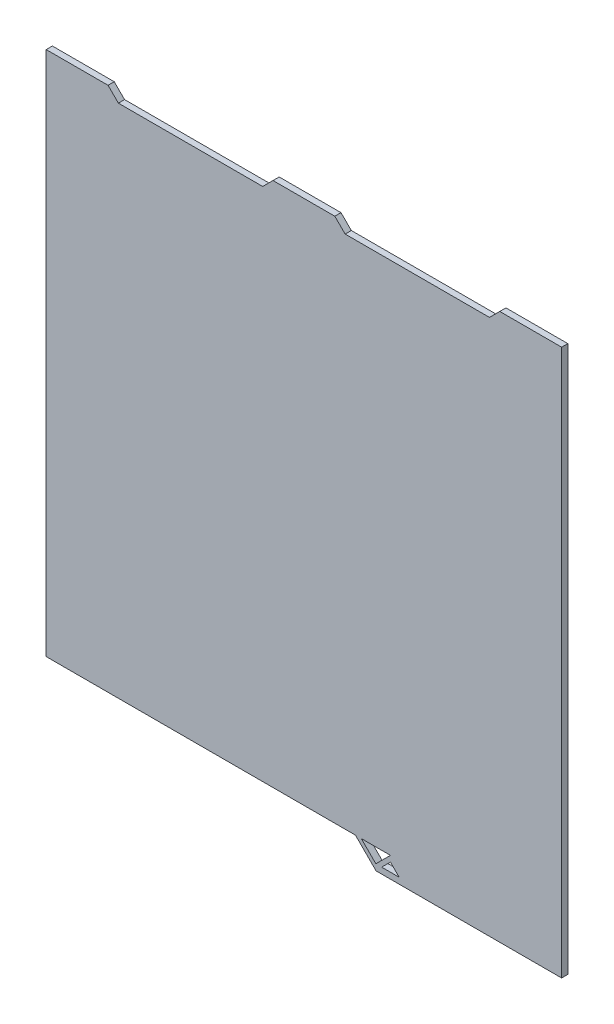
ISO-10303-21;
HEADER;
FILE_DESCRIPTION(('STEP AP214'),'2;1');
FILE_NAME('part.step','',(''),(''),'','','');
FILE_SCHEMA(('AUTOMOTIVE_DESIGN { 1 0 10303 214 1 1 1 1 }'));
ENDSEC;
DATA;
#1=APPLICATION_CONTEXT('core data for automotive mechanical design processes');
#2=APPLICATION_PROTOCOL_DEFINITION('international standard','automotive_design',2000,#1);
#3=PRODUCT_CONTEXT('',#1,'mechanical');
#4=PRODUCT('Part','Part','',(#3));
#5=PRODUCT_RELATED_PRODUCT_CATEGORY('part','',(#4));
#6=PRODUCT_DEFINITION_FORMATION('','',#4);
#7=PRODUCT_DEFINITION_CONTEXT('part definition',#1,'design');
#8=PRODUCT_DEFINITION('design','',#6,#7);
#9=PRODUCT_DEFINITION_SHAPE('','',#8);
#10=(LENGTH_UNIT() NAMED_UNIT(*) SI_UNIT(.MILLI.,.METRE.));
#11=(NAMED_UNIT(*) PLANE_ANGLE_UNIT() SI_UNIT($,.RADIAN.));
#12=(NAMED_UNIT(*) SI_UNIT($,.STERADIAN.) SOLID_ANGLE_UNIT());
#13=UNCERTAINTY_MEASURE_WITH_UNIT(LENGTH_MEASURE(1.E-05),#10,'distance_accuracy_value','');
#14=(GEOMETRIC_REPRESENTATION_CONTEXT(3) GLOBAL_UNCERTAINTY_ASSIGNED_CONTEXT((#13)) GLOBAL_UNIT_ASSIGNED_CONTEXT((#10,
#11,#12)) REPRESENTATION_CONTEXT('',''));
#15=CARTESIAN_POINT('',(0.,0.,0.));
#16=DIRECTION('',(0.,0.,1.));
#17=DIRECTION('',(1.,0.,0.));
#18=AXIS2_PLACEMENT_3D('',#15,#16,#17);
#19=CARTESIAN_POINT('',(-125.,130.,-3.));
#20=DIRECTION('',(0.,1.,0.));
#21=DIRECTION('',(0.,0.,1.));
#22=AXIS2_PLACEMENT_3D('',#19,#20,#21);
#23=PLANE('',#22);
#24=DIRECTION('',(-1.,0.,0.));
#25=VECTOR('',#24,1.);
#26=CARTESIAN_POINT('',(-125.,130.,0.));
#27=LINE('',#26,#25);
#28=CARTESIAN_POINT('',(-95.,130.,0.));
#29=VERTEX_POINT('',#28);
#30=CARTESIAN_POINT('',(-125.,130.,0.));
#31=VERTEX_POINT('',#30);
#32=EDGE_CURVE('E250',#29,#31,#27,.T.);
#33=ORIENTED_EDGE('',*,*,#32,.F.);
#34=DIRECTION('',(0.,0.,1.));
#35=VECTOR('',#34,1.);
#36=CARTESIAN_POINT('',(-95.,130.,-3.));
#37=LINE('',#36,#35);
#38=CARTESIAN_POINT('',(-95.,130.,-3.));
#39=VERTEX_POINT('',#38);
#40=EDGE_CURVE('E49',#39,#29,#37,.T.);
#41=ORIENTED_EDGE('',*,*,#40,.F.);
#42=DIRECTION('',(-1.,0.,0.));
#43=VECTOR('',#42,1.);
#44=CARTESIAN_POINT('',(-125.,130.,-3.));
#45=LINE('',#44,#43);
#46=CARTESIAN_POINT('',(-125.,130.,-3.));
#47=VERTEX_POINT('',#46);
#48=EDGE_CURVE('E297',#39,#47,#45,.T.);
#49=ORIENTED_EDGE('',*,*,#48,.T.);
#50=DIRECTION('',(0.,0.,1.));
#51=VECTOR('',#50,1.);
#52=CARTESIAN_POINT('',(-125.,130.,-3.));
#53=LINE('',#52,#51);
#54=EDGE_CURVE('E11',#47,#31,#53,.T.);
#55=ORIENTED_EDGE('',*,*,#54,.T.);
#56=EDGE_LOOP('',(#33,#41,#49,#55));
#57=FACE_BOUND('',#56,.T.);
#58=ADVANCED_FACE('F39',(#57),#23,.T.);
#59=CARTESIAN_POINT('',(-95.,130.,-3.));
#60=DIRECTION('',(0.707106781186539,0.707106781186556,0.));
#61=DIRECTION('',(-0.707106781186556,0.707106781186539,0.));
#62=AXIS2_PLACEMENT_3D('',#59,#60,#61);
#63=PLANE('',#62);
#64=DIRECTION('',(-0.707106781186556,0.707106781186539,0.));
#65=VECTOR('',#64,1.);
#66=CARTESIAN_POINT('',(-95.,130.,0.));
#67=LINE('',#66,#65);
#68=CARTESIAN_POINT('',(-89.9999999999999,125.,0.));
#69=VERTEX_POINT('',#68);
#70=EDGE_CURVE('E348',#69,#29,#67,.T.);
#71=ORIENTED_EDGE('',*,*,#70,.F.);
#72=DIRECTION('',(0.,0.,1.));
#73=VECTOR('',#72,1.);
#74=CARTESIAN_POINT('',(-89.9999999999999,125.,-3.));
#75=LINE('',#74,#73);
#76=CARTESIAN_POINT('',(-89.9999999999999,125.,-3.));
#77=VERTEX_POINT('',#76);
#78=EDGE_CURVE('E357',#77,#69,#75,.T.);
#79=ORIENTED_EDGE('',*,*,#78,.F.);
#80=DIRECTION('',(-0.707106781186556,0.707106781186539,0.));
#81=VECTOR('',#80,1.);
#82=CARTESIAN_POINT('',(-95.,130.,-3.));
#83=LINE('',#82,#81);
#84=EDGE_CURVE('E293',#77,#39,#83,.T.);
#85=ORIENTED_EDGE('',*,*,#84,.T.);
#86=ORIENTED_EDGE('',*,*,#40,.T.);
#87=EDGE_LOOP('',(#71,#79,#85,#86));
#88=FACE_BOUND('',#87,.T.);
#89=ADVANCED_FACE('F446',(#88),#63,.T.);
#90=CARTESIAN_POINT('',(-19.9999999999999,125.,-3.));
#91=DIRECTION('',(0.,1.,0.));
#92=DIRECTION('',(0.,0.,1.));
#93=AXIS2_PLACEMENT_3D('',#90,#91,#92);
#94=PLANE('',#93);
#95=DIRECTION('',(-1.,0.,0.));
#96=VECTOR('',#95,1.);
#97=CARTESIAN_POINT('',(-19.9999999999999,125.,0.));
#98=LINE('',#97,#96);
#99=CARTESIAN_POINT('',(-19.9999999999999,125.,0.));
#100=VERTEX_POINT('',#99);
#101=EDGE_CURVE('E344',#100,#69,#98,.T.);
#102=ORIENTED_EDGE('',*,*,#101,.F.);
#103=DIRECTION('',(0.,0.,1.));
#104=VECTOR('',#103,1.);
#105=CARTESIAN_POINT('',(-19.9999999999999,125.,-3.));
#106=LINE('',#105,#104);
#107=CARTESIAN_POINT('',(-19.9999999999999,125.,-3.));
#108=VERTEX_POINT('',#107);
#109=EDGE_CURVE('E360',#108,#100,#106,.T.);
#110=ORIENTED_EDGE('',*,*,#109,.F.);
#111=DIRECTION('',(-1.,0.,0.));
#112=VECTOR('',#111,1.);
#113=CARTESIAN_POINT('',(-19.9999999999999,125.,-3.));
#114=LINE('',#113,#112);
#115=EDGE_CURVE('E289',#108,#77,#114,.T.);
#116=ORIENTED_EDGE('',*,*,#115,.T.);
#117=ORIENTED_EDGE('',*,*,#78,.T.);
#118=EDGE_LOOP('',(#102,#110,#116,#117));
#119=FACE_BOUND('',#118,.T.);
#120=ADVANCED_FACE('F444',(#119),#94,.T.);
#121=CARTESIAN_POINT('',(-15.,130.,-3.));
#122=DIRECTION('',(-0.707106781186557,0.707106781186538,0.));
#123=DIRECTION('',(-0.707106781186538,-0.707106781186557,0.));
#124=AXIS2_PLACEMENT_3D('',#121,#122,#123);
#125=PLANE('',#124);
#126=DIRECTION('',(-0.707106781186538,-0.707106781186557,0.));
#127=VECTOR('',#126,1.);
#128=CARTESIAN_POINT('',(-15.,130.,0.));
#129=LINE('',#128,#127);
#130=CARTESIAN_POINT('',(-15.,130.,0.));
#131=VERTEX_POINT('',#130);
#132=EDGE_CURVE('E340',#131,#100,#129,.T.);
#133=ORIENTED_EDGE('',*,*,#132,.F.);
#134=DIRECTION('',(0.,0.,1.));
#135=VECTOR('',#134,1.);
#136=CARTESIAN_POINT('',(-15.,130.,-3.));
#137=LINE('',#136,#135);
#138=CARTESIAN_POINT('',(-15.,130.,-3.));
#139=VERTEX_POINT('',#138);
#140=EDGE_CURVE('E363',#139,#131,#137,.T.);
#141=ORIENTED_EDGE('',*,*,#140,.F.);
#142=DIRECTION('',(-0.707106781186538,-0.707106781186557,0.));
#143=VECTOR('',#142,1.);
#144=CARTESIAN_POINT('',(-15.,130.,-3.));
#145=LINE('',#144,#143);
#146=EDGE_CURVE('E285',#139,#108,#145,.T.);
#147=ORIENTED_EDGE('',*,*,#146,.T.);
#148=ORIENTED_EDGE('',*,*,#109,.T.);
#149=EDGE_LOOP('',(#133,#141,#147,#148));
#150=FACE_BOUND('',#149,.T.);
#151=ADVANCED_FACE('F440',(#150),#125,.T.);
#152=CARTESIAN_POINT('',(-15.,130.,-3.));
#153=DIRECTION('',(0.,1.,0.));
#154=DIRECTION('',(0.,0.,1.));
#155=AXIS2_PLACEMENT_3D('',#152,#153,#154);
#156=PLANE('',#155);
#157=DIRECTION('',(-1.,0.,0.));
#158=VECTOR('',#157,1.);
#159=CARTESIAN_POINT('',(-15.,130.,0.));
#160=LINE('',#159,#158);
#161=CARTESIAN_POINT('',(15.,130.,0.));
#162=VERTEX_POINT('',#161);
#163=EDGE_CURVE('E336',#162,#131,#160,.T.);
#164=ORIENTED_EDGE('',*,*,#163,.F.);
#165=DIRECTION('',(0.,0.,1.));
#166=VECTOR('',#165,1.);
#167=CARTESIAN_POINT('',(15.,130.,-3.));
#168=LINE('',#167,#166);
#169=CARTESIAN_POINT('',(15.,130.,-3.));
#170=VERTEX_POINT('',#169);
#171=EDGE_CURVE('E366',#170,#162,#168,.T.);
#172=ORIENTED_EDGE('',*,*,#171,.F.);
#173=DIRECTION('',(-1.,0.,0.));
#174=VECTOR('',#173,1.);
#175=CARTESIAN_POINT('',(-15.,130.,-3.));
#176=LINE('',#175,#174);
#177=EDGE_CURVE('E281',#170,#139,#176,.T.);
#178=ORIENTED_EDGE('',*,*,#177,.T.);
#179=ORIENTED_EDGE('',*,*,#140,.T.);
#180=EDGE_LOOP('',(#164,#172,#178,#179));
#181=FACE_BOUND('',#180,.T.);
#182=ADVANCED_FACE('F436',(#181),#156,.T.);
#183=CARTESIAN_POINT('',(15.,130.,-3.));
#184=DIRECTION('',(0.707106781186533,0.707106781186562,0.));
#185=DIRECTION('',(-0.707106781186562,0.707106781186533,0.));
#186=AXIS2_PLACEMENT_3D('',#183,#184,#185);
#187=PLANE('',#186);
#188=DIRECTION('',(-0.707106781186562,0.707106781186533,0.));
#189=VECTOR('',#188,1.);
#190=CARTESIAN_POINT('',(15.,130.,0.));
#191=LINE('',#190,#189);
#192=CARTESIAN_POINT('',(20.0000000000001,125.,0.));
#193=VERTEX_POINT('',#192);
#194=EDGE_CURVE('E332',#193,#162,#191,.T.);
#195=ORIENTED_EDGE('',*,*,#194,.F.);
#196=DIRECTION('',(0.,0.,1.));
#197=VECTOR('',#196,1.);
#198=CARTESIAN_POINT('',(20.0000000000001,125.,-3.));
#199=LINE('',#198,#197);
#200=CARTESIAN_POINT('',(20.0000000000001,125.,-3.));
#201=VERTEX_POINT('',#200);
#202=EDGE_CURVE('E369',#201,#193,#199,.T.);
#203=ORIENTED_EDGE('',*,*,#202,.F.);
#204=DIRECTION('',(-0.707106781186562,0.707106781186533,0.));
#205=VECTOR('',#204,1.);
#206=CARTESIAN_POINT('',(15.,130.,-3.));
#207=LINE('',#206,#205);
#208=EDGE_CURVE('E277',#201,#170,#207,.T.);
#209=ORIENTED_EDGE('',*,*,#208,.T.);
#210=ORIENTED_EDGE('',*,*,#171,.T.);
#211=EDGE_LOOP('',(#195,#203,#209,#210));
#212=FACE_BOUND('',#211,.T.);
#213=ADVANCED_FACE('F432',(#212),#187,.T.);
#214=CARTESIAN_POINT('',(89.9999999999999,125.,-3.));
#215=DIRECTION('',(0.,1.,0.));
#216=DIRECTION('',(0.,0.,1.));
#217=AXIS2_PLACEMENT_3D('',#214,#215,#216);
#218=PLANE('',#217);
#219=DIRECTION('',(-1.,0.,0.));
#220=VECTOR('',#219,1.);
#221=CARTESIAN_POINT('',(89.9999999999999,125.,0.));
#222=LINE('',#221,#220);
#223=CARTESIAN_POINT('',(89.9999999999999,125.,0.));
#224=VERTEX_POINT('',#223);
#225=EDGE_CURVE('E328',#224,#193,#222,.T.);
#226=ORIENTED_EDGE('',*,*,#225,.F.);
#227=DIRECTION('',(0.,0.,1.));
#228=VECTOR('',#227,1.);
#229=CARTESIAN_POINT('',(89.9999999999999,125.,-3.));
#230=LINE('',#229,#228);
#231=CARTESIAN_POINT('',(89.9999999999999,125.,-3.));
#232=VERTEX_POINT('',#231);
#233=EDGE_CURVE('E372',#232,#224,#230,.T.);
#234=ORIENTED_EDGE('',*,*,#233,.F.);
#235=DIRECTION('',(-1.,0.,0.));
#236=VECTOR('',#235,1.);
#237=CARTESIAN_POINT('',(89.9999999999999,125.,-3.));
#238=LINE('',#237,#236);
#239=EDGE_CURVE('E273',#232,#201,#238,.T.);
#240=ORIENTED_EDGE('',*,*,#239,.T.);
#241=ORIENTED_EDGE('',*,*,#202,.T.);
#242=EDGE_LOOP('',(#226,#234,#240,#241));
#243=FACE_BOUND('',#242,.T.);
#244=ADVANCED_FACE('F428',(#243),#218,.T.);
#245=CARTESIAN_POINT('',(95.,130.,-3.));
#246=DIRECTION('',(-0.707106781186546,0.707106781186548,0.));
#247=DIRECTION('',(-0.707106781186549,-0.707106781186547,0.));
#248=AXIS2_PLACEMENT_3D('',#245,#246,#247);
#249=PLANE('',#248);
#250=DIRECTION('',(-0.707106781186549,-0.707106781186547,0.));
#251=VECTOR('',#250,1.);
#252=CARTESIAN_POINT('',(95.,130.,0.));
#253=LINE('',#252,#251);
#254=CARTESIAN_POINT('',(95.,130.,0.));
#255=VERTEX_POINT('',#254);
#256=EDGE_CURVE('E324',#255,#224,#253,.T.);
#257=ORIENTED_EDGE('',*,*,#256,.F.);
#258=DIRECTION('',(0.,0.,1.));
#259=VECTOR('',#258,1.);
#260=CARTESIAN_POINT('',(95.,130.,-3.));
#261=LINE('',#260,#259);
#262=CARTESIAN_POINT('',(95.,130.,-3.));
#263=VERTEX_POINT('',#262);
#264=EDGE_CURVE('E375',#263,#255,#261,.T.);
#265=ORIENTED_EDGE('',*,*,#264,.F.);
#266=DIRECTION('',(-0.707106781186549,-0.707106781186547,0.));
#267=VECTOR('',#266,1.);
#268=CARTESIAN_POINT('',(95.,130.,-3.));
#269=LINE('',#268,#267);
#270=EDGE_CURVE('E269',#263,#232,#269,.T.);
#271=ORIENTED_EDGE('',*,*,#270,.T.);
#272=ORIENTED_EDGE('',*,*,#233,.T.);
#273=EDGE_LOOP('',(#257,#265,#271,#272));
#274=FACE_BOUND('',#273,.T.);
#275=ADVANCED_FACE('F426',(#274),#249,.T.);
#276=CARTESIAN_POINT('',(125.,130.,-3.));
#277=DIRECTION('',(0.,1.,0.));
#278=DIRECTION('',(0.,0.,1.));
#279=AXIS2_PLACEMENT_3D('',#276,#277,#278);
#280=PLANE('',#279);
#281=DIRECTION('',(-1.,0.,0.));
#282=VECTOR('',#281,1.);
#283=CARTESIAN_POINT('',(125.,130.,0.));
#284=LINE('',#283,#282);
#285=CARTESIAN_POINT('',(125.,130.,0.));
#286=VERTEX_POINT('',#285);
#287=EDGE_CURVE('E320',#286,#255,#284,.T.);
#288=ORIENTED_EDGE('',*,*,#287,.F.);
#289=DIRECTION('',(0.,0.,1.));
#290=VECTOR('',#289,1.);
#291=CARTESIAN_POINT('',(125.,130.,-3.));
#292=LINE('',#291,#290);
#293=CARTESIAN_POINT('',(125.,130.,-3.));
#294=VERTEX_POINT('',#293);
#295=EDGE_CURVE('E378',#294,#286,#292,.T.);
#296=ORIENTED_EDGE('',*,*,#295,.F.);
#297=DIRECTION('',(-1.,0.,0.));
#298=VECTOR('',#297,1.);
#299=CARTESIAN_POINT('',(125.,130.,-3.));
#300=LINE('',#299,#298);
#301=EDGE_CURVE('E265',#294,#263,#300,.T.);
#302=ORIENTED_EDGE('',*,*,#301,.T.);
#303=ORIENTED_EDGE('',*,*,#264,.T.);
#304=EDGE_LOOP('',(#288,#296,#302,#303));
#305=FACE_BOUND('',#304,.T.);
#306=ADVANCED_FACE('F422',(#305),#280,.T.);
#307=CARTESIAN_POINT('',(125.,125.,-3.));
#308=DIRECTION('',(1.,0.,0.));
#309=DIRECTION('',(0.,1.,0.));
#310=AXIS2_PLACEMENT_3D('',#307,#308,#309);
#311=PLANE('',#310);
#312=DIRECTION('',(0.,1.,0.));
#313=VECTOR('',#312,1.);
#314=CARTESIAN_POINT('',(125.,125.,0.));
#315=LINE('',#314,#313);
#316=CARTESIAN_POINT('',(125.,-135.,0.));
#317=VERTEX_POINT('',#316);
#318=EDGE_CURVE('E316',#317,#286,#315,.T.);
#319=ORIENTED_EDGE('',*,*,#318,.F.);
#320=DIRECTION('',(0.,0.,1.));
#321=VECTOR('',#320,1.);
#322=CARTESIAN_POINT('',(125.,-135.,-3.));
#323=LINE('',#322,#321);
#324=CARTESIAN_POINT('',(125.,-135.,-3.));
#325=VERTEX_POINT('',#324);
#326=EDGE_CURVE('E381',#325,#317,#323,.T.);
#327=ORIENTED_EDGE('',*,*,#326,.F.);
#328=DIRECTION('',(0.,1.,0.));
#329=VECTOR('',#328,1.);
#330=CARTESIAN_POINT('',(125.,-125.,-3.));
#331=LINE('',#330,#329);
#332=EDGE_CURVE('E262',#325,#294,#331,.T.);
#333=ORIENTED_EDGE('',*,*,#332,.T.);
#334=ORIENTED_EDGE('',*,*,#295,.T.);
#335=EDGE_LOOP('',(#319,#327,#333,#334));
#336=FACE_BOUND('',#335,.T.);
#337=ADVANCED_FACE('F415',(#336),#311,.T.);
#338=CARTESIAN_POINT('',(125.,-135.,-3.));
#339=DIRECTION('',(0.,-1.,0.));
#340=DIRECTION('',(0.,0.,-1.));
#341=AXIS2_PLACEMENT_3D('',#338,#339,#340);
#342=PLANE('',#341);
#343=DIRECTION('',(1.,0.,0.));
#344=VECTOR('',#343,1.);
#345=CARTESIAN_POINT('',(125.,-135.,0.));
#346=LINE('',#345,#344);
#347=CARTESIAN_POINT('',(35.,-135.,0.));
#348=VERTEX_POINT('',#347);
#349=EDGE_CURVE('E312',#348,#317,#346,.T.);
#350=ORIENTED_EDGE('',*,*,#349,.F.);
#351=DIRECTION('',(0.,0.,1.));
#352=VECTOR('',#351,1.);
#353=CARTESIAN_POINT('',(35.,-135.,-3.));
#354=LINE('',#353,#352);
#355=CARTESIAN_POINT('',(35.,-135.,-3.));
#356=VERTEX_POINT('',#355);
#357=EDGE_CURVE('E385',#356,#348,#354,.T.);
#358=ORIENTED_EDGE('',*,*,#357,.F.);
#359=DIRECTION('',(1.,0.,0.));
#360=VECTOR('',#359,1.);
#361=CARTESIAN_POINT('',(125.,-135.,-3.));
#362=LINE('',#361,#360);
#363=EDGE_CURVE('E258',#356,#325,#362,.T.);
#364=ORIENTED_EDGE('',*,*,#363,.T.);
#365=ORIENTED_EDGE('',*,*,#326,.T.);
#366=EDGE_LOOP('',(#350,#358,#364,#365));
#367=FACE_BOUND('',#366,.T.);
#368=ADVANCED_FACE('F413',(#367),#342,.T.);
#369=CARTESIAN_POINT('',(35.,-135.,-3.));
#370=DIRECTION('',(-0.707106781186544,-0.707106781186551,0.));
#371=DIRECTION('',(0.707106781186551,-0.707106781186544,0.));
#372=AXIS2_PLACEMENT_3D('',#369,#370,#371);
#373=PLANE('',#372);
#374=DIRECTION('',(0.707106781186551,-0.707106781186544,0.));
#375=VECTOR('',#374,1.);
#376=CARTESIAN_POINT('',(35.,-135.,0.));
#377=LINE('',#376,#375);
#378=CARTESIAN_POINT('',(24.9999999999999,-125.,0.));
#379=VERTEX_POINT('',#378);
#380=EDGE_CURVE('E308',#379,#348,#377,.T.);
#381=ORIENTED_EDGE('',*,*,#380,.F.);
#382=DIRECTION('',(0.,0.,1.));
#383=VECTOR('',#382,1.);
#384=CARTESIAN_POINT('',(24.9999999999999,-125.,-3.));
#385=LINE('',#384,#383);
#386=CARTESIAN_POINT('',(24.9999999999999,-125.,-3.));
#387=VERTEX_POINT('',#386);
#388=EDGE_CURVE('E387',#387,#379,#385,.T.);
#389=ORIENTED_EDGE('',*,*,#388,.F.);
#390=DIRECTION('',(0.707106781186551,-0.707106781186544,0.));
#391=VECTOR('',#390,1.);
#392=CARTESIAN_POINT('',(35.,-135.,-3.));
#393=LINE('',#392,#391);
#394=EDGE_CURVE('E254',#387,#356,#393,.T.);
#395=ORIENTED_EDGE('',*,*,#394,.T.);
#396=ORIENTED_EDGE('',*,*,#357,.T.);
#397=EDGE_LOOP('',(#381,#389,#395,#396));
#398=FACE_BOUND('',#397,.T.);
#399=ADVANCED_FACE('F410',(#398),#373,.T.);
#400=CARTESIAN_POINT('',(-125.,-125.,-3.));
#401=DIRECTION('',(0.,-1.,0.));
#402=DIRECTION('',(1.,0.,0.));
#403=AXIS2_PLACEMENT_3D('',#400,#401,#402);
#404=PLANE('',#403);
#405=DIRECTION('',(1.,0.,0.));
#406=VECTOR('',#405,1.);
#407=CARTESIAN_POINT('',(-125.,-125.,0.));
#408=LINE('',#407,#406);
#409=CARTESIAN_POINT('',(-125.,-125.,0.));
#410=VERTEX_POINT('',#409);
#411=EDGE_CURVE('E304',#410,#379,#408,.T.);
#412=ORIENTED_EDGE('',*,*,#411,.F.);
#413=DIRECTION('',(0.,0.,1.));
#414=VECTOR('',#413,1.);
#415=CARTESIAN_POINT('',(-125.,-125.,-3.));
#416=LINE('',#415,#414);
#417=CARTESIAN_POINT('',(-125.,-125.,-3.));
#418=VERTEX_POINT('',#417);
#419=EDGE_CURVE('E43',#418,#410,#416,.T.);
#420=ORIENTED_EDGE('',*,*,#419,.F.);
#421=DIRECTION('',(1.,0.,0.));
#422=VECTOR('',#421,1.);
#423=CARTESIAN_POINT('',(-125.,-125.,-3.));
#424=LINE('',#423,#422);
#425=EDGE_CURVE('E249',#418,#387,#424,.T.);
#426=ORIENTED_EDGE('',*,*,#425,.T.);
#427=ORIENTED_EDGE('',*,*,#388,.T.);
#428=EDGE_LOOP('',(#412,#420,#426,#427));
#429=FACE_BOUND('',#428,.T.);
#430=ADVANCED_FACE('F397',(#429),#404,.T.);
#431=CARTESIAN_POINT('',(-125.,125.,-3.));
#432=DIRECTION('',(-1.,0.,0.));
#433=DIRECTION('',(0.,-1.,0.));
#434=AXIS2_PLACEMENT_3D('',#431,#432,#433);
#435=PLANE('',#434);
#436=DIRECTION('',(0.,-1.,0.));
#437=VECTOR('',#436,1.);
#438=CARTESIAN_POINT('',(-125.,125.,0.));
#439=LINE('',#438,#437);
#440=EDGE_CURVE('E245',#31,#410,#439,.T.);
#441=ORIENTED_EDGE('',*,*,#440,.F.);
#442=ORIENTED_EDGE('',*,*,#54,.F.);
#443=DIRECTION('',(0.,-1.,0.));
#444=VECTOR('',#443,1.);
#445=CARTESIAN_POINT('',(-125.,125.,-3.));
#446=LINE('',#445,#444);
#447=EDGE_CURVE('E246',#47,#418,#446,.T.);
#448=ORIENTED_EDGE('',*,*,#447,.T.);
#449=ORIENTED_EDGE('',*,*,#419,.T.);
#450=EDGE_LOOP('',(#441,#442,#448,#449));
#451=FACE_BOUND('',#450,.T.);
#452=ADVANCED_FACE('F41',(#451),#435,.T.);
#453=CARTESIAN_POINT('',(0.,0.,-3.));
#454=DIRECTION('',(0.,0.,-1.));
#455=DIRECTION('',(-1.,0.,0.));
#456=AXIS2_PLACEMENT_3D('',#453,#454,#455);
#457=PLANE('',#456);
#458=DIRECTION('',(0.70710678118655,0.707106781186545,0.));
#459=VECTOR('',#458,1.);
#460=CARTESIAN_POINT('',(84.8994949366115,-84.8994949366122,-3.));
#461=LINE('',#460,#459);
#462=CARTESIAN_POINT('',(37.7279220613578,-132.071067811865,-3.));
#463=VERTEX_POINT('',#462);
#464=CARTESIAN_POINT('',(41.9705627484771,-127.828427124746,-3.));
#465=VERTEX_POINT('',#464);
#466=EDGE_CURVE('E242',#463,#465,#461,.T.);
#467=ORIENTED_EDGE('',*,*,#466,.F.);
#468=DIRECTION('',(-1.,0.,0.));
#469=VECTOR('',#468,1.);
#470=CARTESIAN_POINT('',(-4.32007890795257E-13,-132.071067811865,-3.));
#471=LINE('',#470,#469);
#472=CARTESIAN_POINT('',(46.2132034355964,-132.071067811866,-3.));
#473=VERTEX_POINT('',#472);
#474=EDGE_CURVE('E237',#473,#463,#471,.T.);
#475=ORIENTED_EDGE('',*,*,#474,.F.);
#476=DIRECTION('',(0.707106781186541,-0.707106781186554,0.));
#477=VECTOR('',#476,1.);
#478=CARTESIAN_POINT('',(-42.9289321881341,-42.9289321881333,-3.));
#479=LINE('',#478,#477);
#480=EDGE_CURVE('E184',#465,#473,#479,.T.);
#481=ORIENTED_EDGE('',*,*,#480,.F.);
#482=EDGE_LOOP('',(#467,#475,#481));
#483=FACE_BOUND('',#482,.T.);
#484=DIRECTION('',(-0.707106781186549,0.707106781186546,0.));
#485=VECTOR('',#484,1.);
#486=CARTESIAN_POINT('',(-48.585786437627,-48.5857864376273,-3.));
#487=LINE('',#486,#485);
#488=CARTESIAN_POINT('',(34.8994949366116,-132.071067811865,-3.));
#489=VERTEX_POINT('',#488);
#490=CARTESIAN_POINT('',(27.8284271247461,-125.,-3.));
#491=VERTEX_POINT('',#490);
#492=EDGE_CURVE('E234',#489,#491,#487,.T.);
#493=ORIENTED_EDGE('',*,*,#492,.F.);
#494=DIRECTION('',(-0.707106781186546,-0.707106781186549,0.));
#495=VECTOR('',#494,1.);
#496=CARTESIAN_POINT('',(83.4852813742386,-83.4852813742382,-3.));
#497=LINE('',#496,#495);
#498=CARTESIAN_POINT('',(41.9705627484771,-125.,-3.));
#499=VERTEX_POINT('',#498);
#500=EDGE_CURVE('E223',#499,#489,#497,.T.);
#501=ORIENTED_EDGE('',*,*,#500,.F.);
#502=DIRECTION('',(1.,0.,0.));
#503=VECTOR('',#502,1.);
#504=CARTESIAN_POINT('',(3.6799042000401E-13,-125.,-3.));
#505=LINE('',#504,#503);
#506=EDGE_CURVE('E231',#491,#499,#505,.T.);
#507=ORIENTED_EDGE('',*,*,#506,.F.);
#508=EDGE_LOOP('',(#493,#501,#507));
#509=FACE_BOUND('',#508,.T.);
#510=ORIENTED_EDGE('',*,*,#447,.F.);
#511=ORIENTED_EDGE('',*,*,#48,.F.);
#512=ORIENTED_EDGE('',*,*,#84,.F.);
#513=ORIENTED_EDGE('',*,*,#115,.F.);
#514=ORIENTED_EDGE('',*,*,#146,.F.);
#515=ORIENTED_EDGE('',*,*,#177,.F.);
#516=ORIENTED_EDGE('',*,*,#208,.F.);
#517=ORIENTED_EDGE('',*,*,#239,.F.);
#518=ORIENTED_EDGE('',*,*,#270,.F.);
#519=ORIENTED_EDGE('',*,*,#301,.F.);
#520=ORIENTED_EDGE('',*,*,#332,.F.);
#521=ORIENTED_EDGE('',*,*,#363,.F.);
#522=ORIENTED_EDGE('',*,*,#394,.F.);
#523=ORIENTED_EDGE('',*,*,#425,.F.);
#524=EDGE_LOOP('',(#510,#511,#512,#513,#514,#515,#516,#517,#518,#519,#520,#521,#522,#523));
#525=FACE_BOUND('',#524,.T.);
#526=ADVANCED_FACE('F404',(#483,#509,#525),#457,.T.);
#527=CARTESIAN_POINT('',(0.,0.,0.));
#528=DIRECTION('',(0.,0.,-1.));
#529=DIRECTION('',(-1.,0.,0.));
#530=AXIS2_PLACEMENT_3D('',#527,#528,#529);
#531=PLANE('',#530);
#532=DIRECTION('',(1.,0.,0.));
#533=VECTOR('',#532,1.);
#534=CARTESIAN_POINT('',(37.7279220613578,-132.071067811865,0.));
#535=LINE('',#534,#533);
#536=CARTESIAN_POINT('',(37.7279220613578,-132.071067811865,0.));
#537=VERTEX_POINT('',#536);
#538=CARTESIAN_POINT('',(46.2132034355964,-132.071067811866,0.));
#539=VERTEX_POINT('',#538);
#540=EDGE_CURVE('E192',#537,#539,#535,.T.);
#541=ORIENTED_EDGE('',*,*,#540,.F.);
#542=DIRECTION('',(-0.70710678118655,-0.707106781186545,0.));
#543=VECTOR('',#542,1.);
#544=CARTESIAN_POINT('',(37.7279220613578,-132.071067811865,0.));
#545=LINE('',#544,#543);
#546=CARTESIAN_POINT('',(41.9705627484771,-127.828427124746,0.));
#547=VERTEX_POINT('',#546);
#548=EDGE_CURVE('E197',#547,#537,#545,.T.);
#549=ORIENTED_EDGE('',*,*,#548,.F.);
#550=DIRECTION('',(-0.707106781186541,0.707106781186554,0.));
#551=VECTOR('',#550,1.);
#552=CARTESIAN_POINT('',(46.2132034355964,-132.071067811866,0.));
#553=LINE('',#552,#551);
#554=EDGE_CURVE('E181',#539,#547,#553,.T.);
#555=ORIENTED_EDGE('',*,*,#554,.F.);
#556=EDGE_LOOP('',(#541,#549,#555));
#557=FACE_BOUND('',#556,.T.);
#558=DIRECTION('',(0.707106781186546,0.707106781186549,0.));
#559=VECTOR('',#558,1.);
#560=CARTESIAN_POINT('',(34.8994949366116,-132.071067811865,0.));
#561=LINE('',#560,#559);
#562=CARTESIAN_POINT('',(34.8994949366116,-132.071067811865,0.));
#563=VERTEX_POINT('',#562);
#564=CARTESIAN_POINT('',(41.9705627484771,-125.,0.));
#565=VERTEX_POINT('',#564);
#566=EDGE_CURVE('E212',#563,#565,#561,.T.);
#567=ORIENTED_EDGE('',*,*,#566,.F.);
#568=DIRECTION('',(0.707106781186549,-0.707106781186546,0.));
#569=VECTOR('',#568,1.);
#570=CARTESIAN_POINT('',(27.8284271247461,-125.,0.));
#571=LINE('',#570,#569);
#572=CARTESIAN_POINT('',(27.8284271247461,-125.,0.));
#573=VERTEX_POINT('',#572);
#574=EDGE_CURVE('E208',#573,#563,#571,.T.);
#575=ORIENTED_EDGE('',*,*,#574,.F.);
#576=DIRECTION('',(-1.,0.,0.));
#577=VECTOR('',#576,1.);
#578=CARTESIAN_POINT('',(27.8284271247461,-125.,0.));
#579=LINE('',#578,#577);
#580=EDGE_CURVE('E215',#565,#573,#579,.T.);
#581=ORIENTED_EDGE('',*,*,#580,.F.);
#582=EDGE_LOOP('',(#567,#575,#581));
#583=FACE_BOUND('',#582,.T.);
#584=ORIENTED_EDGE('',*,*,#32,.T.);
#585=ORIENTED_EDGE('',*,*,#440,.T.);
#586=ORIENTED_EDGE('',*,*,#411,.T.);
#587=ORIENTED_EDGE('',*,*,#380,.T.);
#588=ORIENTED_EDGE('',*,*,#349,.T.);
#589=ORIENTED_EDGE('',*,*,#318,.T.);
#590=ORIENTED_EDGE('',*,*,#287,.T.);
#591=ORIENTED_EDGE('',*,*,#256,.T.);
#592=ORIENTED_EDGE('',*,*,#225,.T.);
#593=ORIENTED_EDGE('',*,*,#194,.T.);
#594=ORIENTED_EDGE('',*,*,#163,.T.);
#595=ORIENTED_EDGE('',*,*,#132,.T.);
#596=ORIENTED_EDGE('',*,*,#101,.T.);
#597=ORIENTED_EDGE('',*,*,#70,.T.);
#598=EDGE_LOOP('',(#584,#585,#586,#587,#588,#589,#590,#591,#592,#593,#594,#595,#596,#597));
#599=FACE_BOUND('',#598,.T.);
#600=ADVANCED_FACE('F199',(#557,#583,#599),#531,.F.);
#601=CARTESIAN_POINT('',(27.8284271247461,-125.,-9.));
#602=DIRECTION('',(-0.707106781186546,-0.707106781186549,0.));
#603=DIRECTION('',(0.707106781186549,-0.707106781186546,0.));
#604=AXIS2_PLACEMENT_3D('',#601,#602,#603);
#605=PLANE('',#604);
#606=ORIENTED_EDGE('',*,*,#492,.T.);
#607=DIRECTION('',(0.,0.,1.));
#608=VECTOR('',#607,1.);
#609=CARTESIAN_POINT('',(27.8284271247461,-125.,-9.));
#610=LINE('',#609,#608);
#611=EDGE_CURVE('E220',#491,#573,#610,.T.);
#612=ORIENTED_EDGE('',*,*,#611,.T.);
#613=ORIENTED_EDGE('',*,*,#574,.T.);
#614=DIRECTION('',(0.,0.,1.));
#615=VECTOR('',#614,1.);
#616=CARTESIAN_POINT('',(34.8994949366116,-132.071067811865,-9.));
#617=LINE('',#616,#615);
#618=EDGE_CURVE('E219',#489,#563,#617,.T.);
#619=ORIENTED_EDGE('',*,*,#618,.F.);
#620=EDGE_LOOP('',(#606,#612,#613,#619));
#621=FACE_BOUND('',#620,.T.);
#622=ADVANCED_FACE('F486',(#621),#605,.F.);
#623=CARTESIAN_POINT('',(27.8284271247461,-125.,-9.));
#624=DIRECTION('',(0.,1.,0.));
#625=DIRECTION('',(-1.,0.,0.));
#626=AXIS2_PLACEMENT_3D('',#623,#624,#625);
#627=PLANE('',#626);
#628=ORIENTED_EDGE('',*,*,#506,.T.);
#629=DIRECTION('',(0.,0.,1.));
#630=VECTOR('',#629,1.);
#631=CARTESIAN_POINT('',(41.9705627484771,-125.,-9.));
#632=LINE('',#631,#630);
#633=EDGE_CURVE('E65',#499,#565,#632,.T.);
#634=ORIENTED_EDGE('',*,*,#633,.T.);
#635=ORIENTED_EDGE('',*,*,#580,.T.);
#636=ORIENTED_EDGE('',*,*,#611,.F.);
#637=EDGE_LOOP('',(#628,#634,#635,#636));
#638=FACE_BOUND('',#637,.T.);
#639=ADVANCED_FACE('F492',(#638),#627,.F.);
#640=CARTESIAN_POINT('',(34.8994949366116,-132.071067811865,-9.));
#641=DIRECTION('',(0.707106781186549,-0.707106781186546,0.));
#642=DIRECTION('',(0.707106781186546,0.707106781186549,0.));
#643=AXIS2_PLACEMENT_3D('',#640,#641,#642);
#644=PLANE('',#643);
#645=ORIENTED_EDGE('',*,*,#500,.T.);
#646=ORIENTED_EDGE('',*,*,#618,.T.);
#647=ORIENTED_EDGE('',*,*,#566,.T.);
#648=ORIENTED_EDGE('',*,*,#633,.F.);
#649=EDGE_LOOP('',(#645,#646,#647,#648));
#650=FACE_BOUND('',#649,.T.);
#651=ADVANCED_FACE('F494',(#650),#644,.F.);
#652=CARTESIAN_POINT('',(37.7279220613578,-132.071067811865,-9.));
#653=DIRECTION('',(-0.707106781186545,0.70710678118655,0.));
#654=DIRECTION('',(-0.70710678118655,-0.707106781186545,0.));
#655=AXIS2_PLACEMENT_3D('',#652,#653,#654);
#656=PLANE('',#655);
#657=ORIENTED_EDGE('',*,*,#466,.T.);
#658=DIRECTION('',(0.,0.,1.));
#659=VECTOR('',#658,1.);
#660=CARTESIAN_POINT('',(41.9705627484771,-127.828427124746,-9.));
#661=LINE('',#660,#659);
#662=EDGE_CURVE('E187',#465,#547,#661,.T.);
#663=ORIENTED_EDGE('',*,*,#662,.T.);
#664=ORIENTED_EDGE('',*,*,#548,.T.);
#665=DIRECTION('',(0.,0.,1.));
#666=VECTOR('',#665,1.);
#667=CARTESIAN_POINT('',(37.7279220613578,-132.071067811865,-9.));
#668=LINE('',#667,#666);
#669=EDGE_CURVE('E188',#463,#537,#668,.T.);
#670=ORIENTED_EDGE('',*,*,#669,.F.);
#671=EDGE_LOOP('',(#657,#663,#664,#670));
#672=FACE_BOUND('',#671,.T.);
#673=ADVANCED_FACE('F497',(#672),#656,.F.);
#674=CARTESIAN_POINT('',(46.2132034355964,-132.071067811866,-9.));
#675=DIRECTION('',(0.707106781186554,0.707106781186541,0.));
#676=DIRECTION('',(-0.707106781186541,0.707106781186554,0.));
#677=AXIS2_PLACEMENT_3D('',#674,#675,#676);
#678=PLANE('',#677);
#679=ORIENTED_EDGE('',*,*,#480,.T.);
#680=DIRECTION('',(0.,0.,1.));
#681=VECTOR('',#680,1.);
#682=CARTESIAN_POINT('',(46.2132034355964,-132.071067811866,-9.));
#683=LINE('',#682,#681);
#684=EDGE_CURVE('E57',#473,#539,#683,.T.);
#685=ORIENTED_EDGE('',*,*,#684,.T.);
#686=ORIENTED_EDGE('',*,*,#554,.T.);
#687=ORIENTED_EDGE('',*,*,#662,.F.);
#688=EDGE_LOOP('',(#679,#685,#686,#687));
#689=FACE_BOUND('',#688,.T.);
#690=ADVANCED_FACE('F178',(#689),#678,.F.);
#691=CARTESIAN_POINT('',(37.7279220613578,-132.071067811865,-9.));
#692=DIRECTION('',(0.,-1.,0.));
#693=DIRECTION('',(1.,0.,0.));
#694=AXIS2_PLACEMENT_3D('',#691,#692,#693);
#695=PLANE('',#694);
#696=ORIENTED_EDGE('',*,*,#474,.T.);
#697=ORIENTED_EDGE('',*,*,#669,.T.);
#698=ORIENTED_EDGE('',*,*,#540,.T.);
#699=ORIENTED_EDGE('',*,*,#684,.F.);
#700=EDGE_LOOP('',(#696,#697,#698,#699));
#701=FACE_BOUND('',#700,.T.);
#702=ADVANCED_FACE('F193',(#701),#695,.F.);
#703=CLOSED_SHELL('',(#58,#89,#120,#151,#182,#213,#244,#275,#306,#337,#368,#399,#430,#452,#526,
#600,#622,#639,#651,#673,#690,#702));
#704=MANIFOLD_SOLID_BREP('B2',#703);
#705=ADVANCED_BREP_SHAPE_REPRESENTATION('',(#18,#704),#14);
#706=SHAPE_DEFINITION_REPRESENTATION(#9,#705);
ENDSEC;
END-ISO-10303-21;
